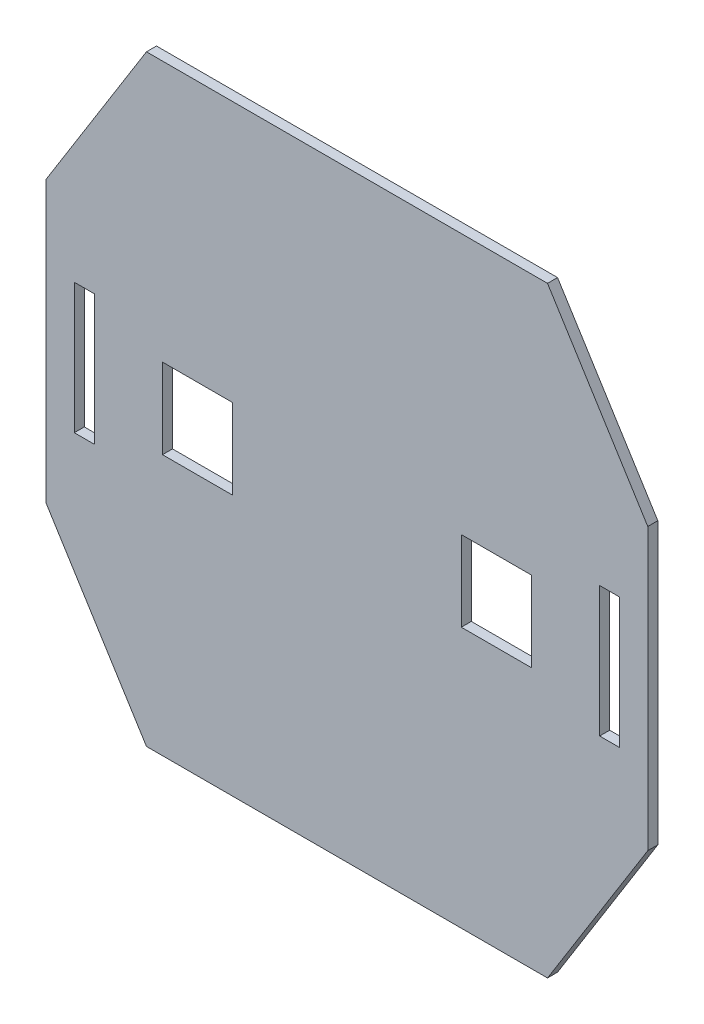
ISO-10303-21;
HEADER;
FILE_DESCRIPTION(('STEP AP214'),'2;1');
FILE_NAME('part.step','',(''),(''),'','','');
FILE_SCHEMA(('AUTOMOTIVE_DESIGN { 1 0 10303 214 1 1 1 1 }'));
ENDSEC;
DATA;
#1=APPLICATION_CONTEXT('core data for automotive mechanical design processes');
#2=APPLICATION_PROTOCOL_DEFINITION('international standard','automotive_design',2000,#1);
#3=PRODUCT_CONTEXT('',#1,'mechanical');
#4=PRODUCT('Part','Part','',(#3));
#5=PRODUCT_RELATED_PRODUCT_CATEGORY('part','',(#4));
#6=PRODUCT_DEFINITION_FORMATION('','',#4);
#7=PRODUCT_DEFINITION_CONTEXT('part definition',#1,'design');
#8=PRODUCT_DEFINITION('design','',#6,#7);
#9=PRODUCT_DEFINITION_SHAPE('','',#8);
#10=(LENGTH_UNIT() NAMED_UNIT(*) SI_UNIT(.MILLI.,.METRE.));
#11=(NAMED_UNIT(*) PLANE_ANGLE_UNIT() SI_UNIT($,.RADIAN.));
#12=(NAMED_UNIT(*) SI_UNIT($,.STERADIAN.) SOLID_ANGLE_UNIT());
#13=UNCERTAINTY_MEASURE_WITH_UNIT(LENGTH_MEASURE(1.E-05),#10,'distance_accuracy_value','');
#14=(GEOMETRIC_REPRESENTATION_CONTEXT(3) GLOBAL_UNCERTAINTY_ASSIGNED_CONTEXT((#13)) GLOBAL_UNIT_ASSIGNED_CONTEXT((#10,
#11,#12)) REPRESENTATION_CONTEXT('',''));
#15=CARTESIAN_POINT('',(0.,0.,0.));
#16=DIRECTION('',(0.,0.,1.));
#17=DIRECTION('',(1.,0.,0.));
#18=AXIS2_PLACEMENT_3D('',#15,#16,#17);
#19=CARTESIAN_POINT('',(99.9999999999999,150.,5.));
#20=DIRECTION('',(0.,-1.,0.));
#21=DIRECTION('',(1.,0.,0.));
#22=AXIS2_PLACEMENT_3D('',#19,#20,#21);
#23=PLANE('',#22);
#24=DIRECTION('',(-1.,0.,0.));
#25=VECTOR('',#24,1.);
#26=CARTESIAN_POINT('',(99.9999999999999,150.,0.));
#27=LINE('',#26,#25);
#28=CARTESIAN_POINT('',(99.9999999999999,150.,0.));
#29=VERTEX_POINT('',#28);
#30=CARTESIAN_POINT('',(-99.9999999999999,150.,0.));
#31=VERTEX_POINT('',#30);
#32=EDGE_CURVE('E281',#29,#31,#27,.T.);
#33=ORIENTED_EDGE('',*,*,#32,.T.);
#34=DIRECTION('',(0.,0.,-1.));
#35=VECTOR('',#34,1.);
#36=CARTESIAN_POINT('',(-99.9999999999999,150.,5.));
#37=LINE('',#36,#35);
#38=CARTESIAN_POINT('',(-99.9999999999999,150.,5.));
#39=VERTEX_POINT('',#38);
#40=EDGE_CURVE('E342',#39,#31,#37,.T.);
#41=ORIENTED_EDGE('',*,*,#40,.F.);
#42=DIRECTION('',(-1.,0.,0.));
#43=VECTOR('',#42,1.);
#44=CARTESIAN_POINT('',(99.9999999999999,150.,5.));
#45=LINE('',#44,#43);
#46=CARTESIAN_POINT('',(99.9999999999999,150.,5.));
#47=VERTEX_POINT('',#46);
#48=EDGE_CURVE('E288',#47,#39,#45,.T.);
#49=ORIENTED_EDGE('',*,*,#48,.F.);
#50=DIRECTION('',(0.,0.,-1.));
#51=VECTOR('',#50,1.);
#52=CARTESIAN_POINT('',(99.9999999999999,150.,5.));
#53=LINE('',#52,#51);
#54=EDGE_CURVE('E306',#47,#29,#53,.T.);
#55=ORIENTED_EDGE('',*,*,#54,.T.);
#56=EDGE_LOOP('',(#33,#41,#49,#55));
#57=FACE_BOUND('',#56,.T.);
#58=ADVANCED_FACE('F39',(#57),#23,.F.);
#59=CARTESIAN_POINT('',(-99.9999999999999,150.,5.));
#60=DIRECTION('',(0.847998304005088,-0.52999894000318,0.));
#61=DIRECTION('',(0.52999894000318,0.847998304005088,0.));
#62=AXIS2_PLACEMENT_3D('',#59,#60,#61);
#63=PLANE('',#62);
#64=DIRECTION('',(-0.52999894000318,-0.847998304005088,0.));
#65=VECTOR('',#64,1.);
#66=CARTESIAN_POINT('',(-99.9999999999999,150.,0.));
#67=LINE('',#66,#65);
#68=CARTESIAN_POINT('',(-150.,69.9999999999999,0.));
#69=VERTEX_POINT('',#68);
#70=EDGE_CURVE('E309',#31,#69,#67,.T.);
#71=ORIENTED_EDGE('',*,*,#70,.T.);
#72=DIRECTION('',(0.,0.,-1.));
#73=VECTOR('',#72,1.);
#74=CARTESIAN_POINT('',(-150.,69.9999999999999,5.));
#75=LINE('',#74,#73);
#76=CARTESIAN_POINT('',(-150.,69.9999999999999,5.));
#77=VERTEX_POINT('',#76);
#78=EDGE_CURVE('E339',#77,#69,#75,.T.);
#79=ORIENTED_EDGE('',*,*,#78,.F.);
#80=DIRECTION('',(-0.52999894000318,-0.847998304005088,0.));
#81=VECTOR('',#80,1.);
#82=CARTESIAN_POINT('',(-99.9999999999999,150.,5.));
#83=LINE('',#82,#81);
#84=EDGE_CURVE('E291',#39,#77,#83,.T.);
#85=ORIENTED_EDGE('',*,*,#84,.F.);
#86=ORIENTED_EDGE('',*,*,#40,.T.);
#87=EDGE_LOOP('',(#71,#79,#85,#86));
#88=FACE_BOUND('',#87,.T.);
#89=ADVANCED_FACE('F425',(#88),#63,.F.);
#90=CARTESIAN_POINT('',(-150.,-69.9999999999999,5.));
#91=DIRECTION('',(1.,0.,0.));
#92=DIRECTION('',(0.,0.,-1.));
#93=AXIS2_PLACEMENT_3D('',#90,#91,#92);
#94=PLANE('',#93);
#95=DIRECTION('',(0.,-1.,0.));
#96=VECTOR('',#95,1.);
#97=CARTESIAN_POINT('',(-150.,-69.9999999999999,0.));
#98=LINE('',#97,#96);
#99=CARTESIAN_POINT('',(-150.,-69.9999999999999,0.));
#100=VERTEX_POINT('',#99);
#101=EDGE_CURVE('E311',#69,#100,#98,.T.);
#102=ORIENTED_EDGE('',*,*,#101,.T.);
#103=DIRECTION('',(0.,0.,-1.));
#104=VECTOR('',#103,1.);
#105=CARTESIAN_POINT('',(-150.,-69.9999999999999,5.));
#106=LINE('',#105,#104);
#107=CARTESIAN_POINT('',(-150.,-69.9999999999999,5.));
#108=VERTEX_POINT('',#107);
#109=EDGE_CURVE('E336',#108,#100,#106,.T.);
#110=ORIENTED_EDGE('',*,*,#109,.F.);
#111=DIRECTION('',(0.,-1.,0.));
#112=VECTOR('',#111,1.);
#113=CARTESIAN_POINT('',(-150.,-69.9999999999999,5.));
#114=LINE('',#113,#112);
#115=EDGE_CURVE('E294',#77,#108,#114,.T.);
#116=ORIENTED_EDGE('',*,*,#115,.F.);
#117=ORIENTED_EDGE('',*,*,#78,.T.);
#118=EDGE_LOOP('',(#102,#110,#116,#117));
#119=FACE_BOUND('',#118,.T.);
#120=ADVANCED_FACE('F430',(#119),#94,.F.);
#121=CARTESIAN_POINT('',(-99.9999999999999,-150.,5.));
#122=DIRECTION('',(0.847998304005088,0.52999894000318,0.));
#123=DIRECTION('',(-0.52999894000318,0.847998304005088,0.));
#124=AXIS2_PLACEMENT_3D('',#121,#122,#123);
#125=PLANE('',#124);
#126=DIRECTION('',(0.52999894000318,-0.847998304005088,0.));
#127=VECTOR('',#126,1.);
#128=CARTESIAN_POINT('',(-99.9999999999999,-150.,0.));
#129=LINE('',#128,#127);
#130=CARTESIAN_POINT('',(-99.9999999999999,-150.,0.));
#131=VERTEX_POINT('',#130);
#132=EDGE_CURVE('E313',#100,#131,#129,.T.);
#133=ORIENTED_EDGE('',*,*,#132,.T.);
#134=DIRECTION('',(0.,0.,-1.));
#135=VECTOR('',#134,1.);
#136=CARTESIAN_POINT('',(-99.9999999999999,-150.,5.));
#137=LINE('',#136,#135);
#138=CARTESIAN_POINT('',(-99.9999999999999,-150.,5.));
#139=VERTEX_POINT('',#138);
#140=EDGE_CURVE('E333',#139,#131,#137,.T.);
#141=ORIENTED_EDGE('',*,*,#140,.F.);
#142=DIRECTION('',(0.52999894000318,-0.847998304005088,0.));
#143=VECTOR('',#142,1.);
#144=CARTESIAN_POINT('',(-99.9999999999999,-150.,5.));
#145=LINE('',#144,#143);
#146=EDGE_CURVE('E296',#108,#139,#145,.T.);
#147=ORIENTED_EDGE('',*,*,#146,.F.);
#148=ORIENTED_EDGE('',*,*,#109,.T.);
#149=EDGE_LOOP('',(#133,#141,#147,#148));
#150=FACE_BOUND('',#149,.T.);
#151=ADVANCED_FACE('F463',(#150),#125,.F.);
#152=CARTESIAN_POINT('',(99.9999999999999,-150.,5.));
#153=DIRECTION('',(0.,1.,0.));
#154=DIRECTION('',(-1.,0.,0.));
#155=AXIS2_PLACEMENT_3D('',#152,#153,#154);
#156=PLANE('',#155);
#157=DIRECTION('',(1.,0.,0.));
#158=VECTOR('',#157,1.);
#159=CARTESIAN_POINT('',(99.9999999999999,-150.,0.));
#160=LINE('',#159,#158);
#161=CARTESIAN_POINT('',(99.9999999999999,-150.,0.));
#162=VERTEX_POINT('',#161);
#163=EDGE_CURVE('E315',#131,#162,#160,.T.);
#164=ORIENTED_EDGE('',*,*,#163,.T.);
#165=DIRECTION('',(0.,0.,-1.));
#166=VECTOR('',#165,1.);
#167=CARTESIAN_POINT('',(99.9999999999999,-150.,5.));
#168=LINE('',#167,#166);
#169=CARTESIAN_POINT('',(99.9999999999999,-150.,5.));
#170=VERTEX_POINT('',#169);
#171=EDGE_CURVE('E330',#170,#162,#168,.T.);
#172=ORIENTED_EDGE('',*,*,#171,.F.);
#173=DIRECTION('',(1.,0.,0.));
#174=VECTOR('',#173,1.);
#175=CARTESIAN_POINT('',(99.9999999999999,-150.,5.));
#176=LINE('',#175,#174);
#177=EDGE_CURVE('E298',#139,#170,#176,.T.);
#178=ORIENTED_EDGE('',*,*,#177,.F.);
#179=ORIENTED_EDGE('',*,*,#140,.T.);
#180=EDGE_LOOP('',(#164,#172,#178,#179));
#181=FACE_BOUND('',#180,.T.);
#182=ADVANCED_FACE('F459',(#181),#156,.F.);
#183=CARTESIAN_POINT('',(99.9999999999999,-150.,5.));
#184=DIRECTION('',(-0.847998304005088,0.52999894000318,0.));
#185=DIRECTION('',(-0.52999894000318,-0.847998304005088,0.));
#186=AXIS2_PLACEMENT_3D('',#183,#184,#185);
#187=PLANE('',#186);
#188=DIRECTION('',(0.52999894000318,0.847998304005088,0.));
#189=VECTOR('',#188,1.);
#190=CARTESIAN_POINT('',(99.9999999999999,-150.,0.));
#191=LINE('',#190,#189);
#192=CARTESIAN_POINT('',(150.,-69.9999999999999,0.));
#193=VERTEX_POINT('',#192);
#194=EDGE_CURVE('E317',#162,#193,#191,.T.);
#195=ORIENTED_EDGE('',*,*,#194,.T.);
#196=DIRECTION('',(0.,0.,-1.));
#197=VECTOR('',#196,1.);
#198=CARTESIAN_POINT('',(150.,-69.9999999999999,5.));
#199=LINE('',#198,#197);
#200=CARTESIAN_POINT('',(150.,-69.9999999999999,5.));
#201=VERTEX_POINT('',#200);
#202=EDGE_CURVE('E327',#201,#193,#199,.T.);
#203=ORIENTED_EDGE('',*,*,#202,.F.);
#204=DIRECTION('',(0.52999894000318,0.847998304005088,0.));
#205=VECTOR('',#204,1.);
#206=CARTESIAN_POINT('',(99.9999999999999,-150.,5.));
#207=LINE('',#206,#205);
#208=EDGE_CURVE('E300',#170,#201,#207,.T.);
#209=ORIENTED_EDGE('',*,*,#208,.F.);
#210=ORIENTED_EDGE('',*,*,#171,.T.);
#211=EDGE_LOOP('',(#195,#203,#209,#210));
#212=FACE_BOUND('',#211,.T.);
#213=ADVANCED_FACE('F454',(#212),#187,.F.);
#214=CARTESIAN_POINT('',(150.,-69.9999999999999,5.));
#215=DIRECTION('',(-1.,0.,0.));
#216=DIRECTION('',(0.,0.,1.));
#217=AXIS2_PLACEMENT_3D('',#214,#215,#216);
#218=PLANE('',#217);
#219=DIRECTION('',(0.,1.,0.));
#220=VECTOR('',#219,1.);
#221=CARTESIAN_POINT('',(150.,-69.9999999999999,0.));
#222=LINE('',#221,#220);
#223=CARTESIAN_POINT('',(150.,69.9999999999999,0.));
#224=VERTEX_POINT('',#223);
#225=EDGE_CURVE('E319',#193,#224,#222,.T.);
#226=ORIENTED_EDGE('',*,*,#225,.T.);
#227=DIRECTION('',(0.,0.,-1.));
#228=VECTOR('',#227,1.);
#229=CARTESIAN_POINT('',(150.,69.9999999999999,5.));
#230=LINE('',#229,#228);
#231=CARTESIAN_POINT('',(150.,69.9999999999999,5.));
#232=VERTEX_POINT('',#231);
#233=EDGE_CURVE('E324',#232,#224,#230,.T.);
#234=ORIENTED_EDGE('',*,*,#233,.F.);
#235=DIRECTION('',(0.,1.,0.));
#236=VECTOR('',#235,1.);
#237=CARTESIAN_POINT('',(150.,-69.9999999999999,5.));
#238=LINE('',#237,#236);
#239=EDGE_CURVE('E302',#201,#232,#238,.T.);
#240=ORIENTED_EDGE('',*,*,#239,.F.);
#241=ORIENTED_EDGE('',*,*,#202,.T.);
#242=EDGE_LOOP('',(#226,#234,#240,#241));
#243=FACE_BOUND('',#242,.T.);
#244=ADVANCED_FACE('F449',(#243),#218,.F.);
#245=CARTESIAN_POINT('',(99.9999999999999,150.,5.));
#246=DIRECTION('',(-0.847998304005088,-0.52999894000318,0.));
#247=DIRECTION('',(0.52999894000318,-0.847998304005088,0.));
#248=AXIS2_PLACEMENT_3D('',#245,#246,#247);
#249=PLANE('',#248);
#250=DIRECTION('',(-0.52999894000318,0.847998304005088,0.));
#251=VECTOR('',#250,1.);
#252=CARTESIAN_POINT('',(99.9999999999999,150.,0.));
#253=LINE('',#252,#251);
#254=EDGE_CURVE('E292',#224,#29,#253,.T.);
#255=ORIENTED_EDGE('',*,*,#254,.T.);
#256=ORIENTED_EDGE('',*,*,#54,.F.);
#257=DIRECTION('',(-0.52999894000318,0.847998304005088,0.));
#258=VECTOR('',#257,1.);
#259=CARTESIAN_POINT('',(99.9999999999999,150.,5.));
#260=LINE('',#259,#258);
#261=EDGE_CURVE('E304',#232,#47,#260,.T.);
#262=ORIENTED_EDGE('',*,*,#261,.F.);
#263=ORIENTED_EDGE('',*,*,#233,.T.);
#264=EDGE_LOOP('',(#255,#256,#262,#263));
#265=FACE_BOUND('',#264,.T.);
#266=ADVANCED_FACE('F397',(#265),#249,.F.);
#267=CARTESIAN_POINT('',(0.,0.,5.));
#268=DIRECTION('',(0.,0.,-1.));
#269=DIRECTION('',(-1.,0.,0.));
#270=AXIS2_PLACEMENT_3D('',#267,#268,#269);
#271=PLANE('',#270);
#272=DIRECTION('',(-1.,0.,0.));
#273=VECTOR('',#272,1.);
#274=CARTESIAN_POINT('',(135.993475802712,32.5,5.));
#275=LINE('',#274,#273);
#276=CARTESIAN_POINT('',(135.993475802712,32.5,5.));
#277=VERTEX_POINT('',#276);
#278=CARTESIAN_POINT('',(125.993475802712,32.5,5.));
#279=VERTEX_POINT('',#278);
#280=EDGE_CURVE('E266',#277,#279,#275,.T.);
#281=ORIENTED_EDGE('',*,*,#280,.F.);
#282=DIRECTION('',(0.,1.,0.));
#283=VECTOR('',#282,1.);
#284=CARTESIAN_POINT('',(135.993475802712,-32.5,5.));
#285=LINE('',#284,#283);
#286=CARTESIAN_POINT('',(135.993475802712,-32.5,5.));
#287=VERTEX_POINT('',#286);
#288=EDGE_CURVE('E53',#287,#277,#285,.T.);
#289=ORIENTED_EDGE('',*,*,#288,.F.);
#290=DIRECTION('',(1.,0.,0.));
#291=VECTOR('',#290,1.);
#292=CARTESIAN_POINT('',(135.993475802712,-32.5,5.));
#293=LINE('',#292,#291);
#294=CARTESIAN_POINT('',(125.993475802712,-32.5,5.));
#295=VERTEX_POINT('',#294);
#296=EDGE_CURVE('E254',#295,#287,#293,.T.);
#297=ORIENTED_EDGE('',*,*,#296,.F.);
#298=DIRECTION('',(0.,-1.,0.));
#299=VECTOR('',#298,1.);
#300=CARTESIAN_POINT('',(125.993475802712,-32.5,5.));
#301=LINE('',#300,#299);
#302=EDGE_CURVE('E263',#279,#295,#301,.T.);
#303=ORIENTED_EDGE('',*,*,#302,.F.);
#304=EDGE_LOOP('',(#281,#289,#297,#303));
#305=FACE_BOUND('',#304,.T.);
#306=DIRECTION('',(-1.,0.,0.));
#307=VECTOR('',#306,1.);
#308=CARTESIAN_POINT('',(-135.993475802712,32.5,5.));
#309=LINE('',#308,#307);
#310=CARTESIAN_POINT('',(-125.993475802712,32.5,5.));
#311=VERTEX_POINT('',#310);
#312=CARTESIAN_POINT('',(-135.993475802712,32.5,5.));
#313=VERTEX_POINT('',#312);
#314=EDGE_CURVE('E248',#311,#313,#309,.T.);
#315=ORIENTED_EDGE('',*,*,#314,.F.);
#316=DIRECTION('',(0.,1.,0.));
#317=VECTOR('',#316,1.);
#318=CARTESIAN_POINT('',(-125.993475802712,-32.5,5.));
#319=LINE('',#318,#317);
#320=CARTESIAN_POINT('',(-125.993475802712,-32.5,5.));
#321=VERTEX_POINT('',#320);
#322=EDGE_CURVE('E61',#321,#311,#319,.T.);
#323=ORIENTED_EDGE('',*,*,#322,.F.);
#324=DIRECTION('',(1.,0.,0.));
#325=VECTOR('',#324,1.);
#326=CARTESIAN_POINT('',(-135.993475802712,-32.5,5.));
#327=LINE('',#326,#325);
#328=CARTESIAN_POINT('',(-135.993475802712,-32.5,5.));
#329=VERTEX_POINT('',#328);
#330=EDGE_CURVE('E236',#329,#321,#327,.T.);
#331=ORIENTED_EDGE('',*,*,#330,.F.);
#332=DIRECTION('',(0.,-1.,0.));
#333=VECTOR('',#332,1.);
#334=CARTESIAN_POINT('',(-135.993475802712,-32.5,5.));
#335=LINE('',#334,#333);
#336=EDGE_CURVE('E245',#313,#329,#335,.T.);
#337=ORIENTED_EDGE('',*,*,#336,.F.);
#338=EDGE_LOOP('',(#315,#323,#331,#337));
#339=FACE_BOUND('',#338,.T.);
#340=DIRECTION('',(1.,0.,0.));
#341=VECTOR('',#340,1.);
#342=CARTESIAN_POINT('',(57.,-20.,5.));
#343=LINE('',#342,#341);
#344=CARTESIAN_POINT('',(57.,-20.,5.));
#345=VERTEX_POINT('',#344);
#346=CARTESIAN_POINT('',(92.,-20.,5.));
#347=VERTEX_POINT('',#346);
#348=EDGE_CURVE('E226',#345,#347,#343,.T.);
#349=ORIENTED_EDGE('',*,*,#348,.F.);
#350=DIRECTION('',(0.,-1.,0.));
#351=VECTOR('',#350,1.);
#352=CARTESIAN_POINT('',(57.,-20.,5.));
#353=LINE('',#352,#351);
#354=CARTESIAN_POINT('',(57.,20.,5.));
#355=VERTEX_POINT('',#354);
#356=EDGE_CURVE('E204',#355,#345,#353,.T.);
#357=ORIENTED_EDGE('',*,*,#356,.F.);
#358=DIRECTION('',(-1.,0.,0.));
#359=VECTOR('',#358,1.);
#360=CARTESIAN_POINT('',(57.,20.,5.));
#361=LINE('',#360,#359);
#362=CARTESIAN_POINT('',(92.,20.,5.));
#363=VERTEX_POINT('',#362);
#364=EDGE_CURVE('E213',#363,#355,#361,.T.);
#365=ORIENTED_EDGE('',*,*,#364,.F.);
#366=DIRECTION('',(0.,1.,0.));
#367=VECTOR('',#366,1.);
#368=CARTESIAN_POINT('',(92.,-20.,5.));
#369=LINE('',#368,#367);
#370=EDGE_CURVE('E219',#347,#363,#369,.T.);
#371=ORIENTED_EDGE('',*,*,#370,.F.);
#372=EDGE_LOOP('',(#349,#357,#365,#371));
#373=FACE_BOUND('',#372,.T.);
#374=DIRECTION('',(1.,0.,0.));
#375=VECTOR('',#374,1.);
#376=CARTESIAN_POINT('',(-57.,-20.,5.));
#377=LINE('',#376,#375);
#378=CARTESIAN_POINT('',(-92.,-20.,5.));
#379=VERTEX_POINT('',#378);
#380=CARTESIAN_POINT('',(-57.,-20.,5.));
#381=VERTEX_POINT('',#380);
#382=EDGE_CURVE('E229',#379,#381,#377,.T.);
#383=ORIENTED_EDGE('',*,*,#382,.F.);
#384=DIRECTION('',(0.,-1.,0.));
#385=VECTOR('',#384,1.);
#386=CARTESIAN_POINT('',(-92.,-20.,5.));
#387=LINE('',#386,#385);
#388=CARTESIAN_POINT('',(-92.,20.,5.));
#389=VERTEX_POINT('',#388);
#390=EDGE_CURVE('E227',#389,#379,#387,.T.);
#391=ORIENTED_EDGE('',*,*,#390,.F.);
#392=DIRECTION('',(-1.,0.,0.));
#393=VECTOR('',#392,1.);
#394=CARTESIAN_POINT('',(-57.,20.,5.));
#395=LINE('',#394,#393);
#396=CARTESIAN_POINT('',(-57.,20.,5.));
#397=VERTEX_POINT('',#396);
#398=EDGE_CURVE('E275',#397,#389,#395,.T.);
#399=ORIENTED_EDGE('',*,*,#398,.F.);
#400=DIRECTION('',(0.,1.,0.));
#401=VECTOR('',#400,1.);
#402=CARTESIAN_POINT('',(-57.,-20.,5.));
#403=LINE('',#402,#401);
#404=EDGE_CURVE('E272',#381,#397,#403,.T.);
#405=ORIENTED_EDGE('',*,*,#404,.F.);
#406=EDGE_LOOP('',(#383,#391,#399,#405));
#407=FACE_BOUND('',#406,.T.);
#408=ORIENTED_EDGE('',*,*,#48,.T.);
#409=ORIENTED_EDGE('',*,*,#84,.T.);
#410=ORIENTED_EDGE('',*,*,#115,.T.);
#411=ORIENTED_EDGE('',*,*,#146,.T.);
#412=ORIENTED_EDGE('',*,*,#177,.T.);
#413=ORIENTED_EDGE('',*,*,#208,.T.);
#414=ORIENTED_EDGE('',*,*,#239,.T.);
#415=ORIENTED_EDGE('',*,*,#261,.T.);
#416=EDGE_LOOP('',(#408,#409,#410,#411,#412,#413,#414,#415));
#417=FACE_BOUND('',#416,.T.);
#418=ADVANCED_FACE('F223',(#305,#339,#373,#407,#417),#271,.F.);
#419=CARTESIAN_POINT('',(0.,0.,0.));
#420=DIRECTION('',(0.,0.,-1.));
#421=DIRECTION('',(-1.,0.,0.));
#422=AXIS2_PLACEMENT_3D('',#419,#420,#421);
#423=PLANE('',#422);
#424=DIRECTION('',(0.,-1.,0.));
#425=VECTOR('',#424,1.);
#426=CARTESIAN_POINT('',(135.993475802712,0.,0.));
#427=LINE('',#426,#425);
#428=CARTESIAN_POINT('',(135.993475802712,32.5,0.));
#429=VERTEX_POINT('',#428);
#430=CARTESIAN_POINT('',(135.993475802712,-32.5,0.));
#431=VERTEX_POINT('',#430);
#432=EDGE_CURVE('E11',#429,#431,#427,.T.);
#433=ORIENTED_EDGE('',*,*,#432,.F.);
#434=DIRECTION('',(1.,0.,0.));
#435=VECTOR('',#434,1.);
#436=CARTESIAN_POINT('',(0.,32.4999999999999,0.));
#437=LINE('',#436,#435);
#438=CARTESIAN_POINT('',(125.993475802712,32.5,0.));
#439=VERTEX_POINT('',#438);
#440=EDGE_CURVE('E371',#439,#429,#437,.T.);
#441=ORIENTED_EDGE('',*,*,#440,.F.);
#442=DIRECTION('',(0.,1.,0.));
#443=VECTOR('',#442,1.);
#444=CARTESIAN_POINT('',(125.993475802712,0.,0.));
#445=LINE('',#444,#443);
#446=CARTESIAN_POINT('',(125.993475802712,-32.5,0.));
#447=VERTEX_POINT('',#446);
#448=EDGE_CURVE('E373',#447,#439,#445,.T.);
#449=ORIENTED_EDGE('',*,*,#448,.F.);
#450=DIRECTION('',(-1.,0.,0.));
#451=VECTOR('',#450,1.);
#452=CARTESIAN_POINT('',(0.,-32.5000000000001,0.));
#453=LINE('',#452,#451);
#454=EDGE_CURVE('E46',#431,#447,#453,.T.);
#455=ORIENTED_EDGE('',*,*,#454,.F.);
#456=EDGE_LOOP('',(#433,#441,#449,#455));
#457=FACE_BOUND('',#456,.T.);
#458=DIRECTION('',(0.,-1.,0.));
#459=VECTOR('',#458,1.);
#460=CARTESIAN_POINT('',(-125.993475802712,0.,0.));
#461=LINE('',#460,#459);
#462=CARTESIAN_POINT('',(-125.993475802712,32.5,0.));
#463=VERTEX_POINT('',#462);
#464=CARTESIAN_POINT('',(-125.993475802712,-32.5,0.));
#465=VERTEX_POINT('',#464);
#466=EDGE_CURVE('E369',#463,#465,#461,.T.);
#467=ORIENTED_EDGE('',*,*,#466,.F.);
#468=DIRECTION('',(1.,0.,0.));
#469=VECTOR('',#468,1.);
#470=CARTESIAN_POINT('',(0.,32.5,0.));
#471=LINE('',#470,#469);
#472=CARTESIAN_POINT('',(-135.993475802712,32.5,0.));
#473=VERTEX_POINT('',#472);
#474=EDGE_CURVE('E362',#473,#463,#471,.T.);
#475=ORIENTED_EDGE('',*,*,#474,.F.);
#476=DIRECTION('',(0.,1.,0.));
#477=VECTOR('',#476,1.);
#478=CARTESIAN_POINT('',(-135.993475802712,0.,0.));
#479=LINE('',#478,#477);
#480=CARTESIAN_POINT('',(-135.993475802712,-32.5,0.));
#481=VERTEX_POINT('',#480);
#482=EDGE_CURVE('E364',#481,#473,#479,.T.);
#483=ORIENTED_EDGE('',*,*,#482,.F.);
#484=DIRECTION('',(-1.,0.,0.));
#485=VECTOR('',#484,1.);
#486=CARTESIAN_POINT('',(0.,-32.5,0.));
#487=LINE('',#486,#485);
#488=EDGE_CURVE('E367',#465,#481,#487,.T.);
#489=ORIENTED_EDGE('',*,*,#488,.F.);
#490=EDGE_LOOP('',(#467,#475,#483,#489));
#491=FACE_BOUND('',#490,.T.);
#492=DIRECTION('',(0.,1.,0.));
#493=VECTOR('',#492,1.);
#494=CARTESIAN_POINT('',(57.,0.,0.));
#495=LINE('',#494,#493);
#496=CARTESIAN_POINT('',(57.,-20.,0.));
#497=VERTEX_POINT('',#496);
#498=CARTESIAN_POINT('',(57.,20.,0.));
#499=VERTEX_POINT('',#498);
#500=EDGE_CURVE('E207',#497,#499,#495,.T.);
#501=ORIENTED_EDGE('',*,*,#500,.F.);
#502=DIRECTION('',(-1.,0.,0.));
#503=VECTOR('',#502,1.);
#504=CARTESIAN_POINT('',(0.,-20.,0.));
#505=LINE('',#504,#503);
#506=CARTESIAN_POINT('',(92.,-20.,0.));
#507=VERTEX_POINT('',#506);
#508=EDGE_CURVE('E354',#507,#497,#505,.T.);
#509=ORIENTED_EDGE('',*,*,#508,.F.);
#510=DIRECTION('',(0.,-1.,0.));
#511=VECTOR('',#510,1.);
#512=CARTESIAN_POINT('',(92.,0.,0.));
#513=LINE('',#512,#511);
#514=CARTESIAN_POINT('',(92.,20.,0.));
#515=VERTEX_POINT('',#514);
#516=EDGE_CURVE('E356',#515,#507,#513,.T.);
#517=ORIENTED_EDGE('',*,*,#516,.F.);
#518=DIRECTION('',(1.,0.,0.));
#519=VECTOR('',#518,1.);
#520=CARTESIAN_POINT('',(0.,20.,0.));
#521=LINE('',#520,#519);
#522=EDGE_CURVE('E359',#499,#515,#521,.T.);
#523=ORIENTED_EDGE('',*,*,#522,.F.);
#524=EDGE_LOOP('',(#501,#509,#517,#523));
#525=FACE_BOUND('',#524,.T.);
#526=DIRECTION('',(0.,1.,0.));
#527=VECTOR('',#526,1.);
#528=CARTESIAN_POINT('',(-92.,0.,0.));
#529=LINE('',#528,#527);
#530=CARTESIAN_POINT('',(-92.,-20.,0.));
#531=VERTEX_POINT('',#530);
#532=CARTESIAN_POINT('',(-92.,20.,0.));
#533=VERTEX_POINT('',#532);
#534=EDGE_CURVE('E352',#531,#533,#529,.T.);
#535=ORIENTED_EDGE('',*,*,#534,.F.);
#536=DIRECTION('',(-1.,0.,0.));
#537=VECTOR('',#536,1.);
#538=CARTESIAN_POINT('',(0.,-20.,0.));
#539=LINE('',#538,#537);
#540=CARTESIAN_POINT('',(-57.,-20.,0.));
#541=VERTEX_POINT('',#540);
#542=EDGE_CURVE('E345',#541,#531,#539,.T.);
#543=ORIENTED_EDGE('',*,*,#542,.F.);
#544=DIRECTION('',(0.,-1.,0.));
#545=VECTOR('',#544,1.);
#546=CARTESIAN_POINT('',(-57.,0.,0.));
#547=LINE('',#546,#545);
#548=CARTESIAN_POINT('',(-57.,20.,0.));
#549=VERTEX_POINT('',#548);
#550=EDGE_CURVE('E347',#549,#541,#547,.T.);
#551=ORIENTED_EDGE('',*,*,#550,.F.);
#552=DIRECTION('',(1.,0.,0.));
#553=VECTOR('',#552,1.);
#554=CARTESIAN_POINT('',(0.,20.,0.));
#555=LINE('',#554,#553);
#556=EDGE_CURVE('E350',#533,#549,#555,.T.);
#557=ORIENTED_EDGE('',*,*,#556,.F.);
#558=EDGE_LOOP('',(#535,#543,#551,#557));
#559=FACE_BOUND('',#558,.T.);
#560=ORIENTED_EDGE('',*,*,#32,.F.);
#561=ORIENTED_EDGE('',*,*,#254,.F.);
#562=ORIENTED_EDGE('',*,*,#225,.F.);
#563=ORIENTED_EDGE('',*,*,#194,.F.);
#564=ORIENTED_EDGE('',*,*,#163,.F.);
#565=ORIENTED_EDGE('',*,*,#132,.F.);
#566=ORIENTED_EDGE('',*,*,#101,.F.);
#567=ORIENTED_EDGE('',*,*,#70,.F.);
#568=EDGE_LOOP('',(#560,#561,#562,#563,#564,#565,#566,#567));
#569=FACE_BOUND('',#568,.T.);
#570=ADVANCED_FACE('F388',(#457,#491,#525,#559,#569),#423,.T.);
#571=CARTESIAN_POINT('',(-92.,-20.,-15.));
#572=DIRECTION('',(-1.,0.,0.));
#573=DIRECTION('',(0.,0.,1.));
#574=AXIS2_PLACEMENT_3D('',#571,#572,#573);
#575=PLANE('',#574);
#576=ORIENTED_EDGE('',*,*,#534,.T.);
#577=DIRECTION('',(0.,0.,1.));
#578=VECTOR('',#577,1.);
#579=CARTESIAN_POINT('',(-92.,20.,-15.));
#580=LINE('',#579,#578);
#581=EDGE_CURVE('E279',#533,#389,#580,.T.);
#582=ORIENTED_EDGE('',*,*,#581,.T.);
#583=ORIENTED_EDGE('',*,*,#390,.T.);
#584=DIRECTION('',(0.,0.,1.));
#585=VECTOR('',#584,1.);
#586=CARTESIAN_POINT('',(-92.,-20.,-15.));
#587=LINE('',#586,#585);
#588=EDGE_CURVE('E278',#531,#379,#587,.T.);
#589=ORIENTED_EDGE('',*,*,#588,.F.);
#590=EDGE_LOOP('',(#576,#582,#583,#589));
#591=FACE_BOUND('',#590,.T.);
#592=ADVANCED_FACE('F482',(#591),#575,.F.);
#593=CARTESIAN_POINT('',(-57.,20.,-15.));
#594=DIRECTION('',(0.,1.,0.));
#595=DIRECTION('',(-1.,0.,0.));
#596=AXIS2_PLACEMENT_3D('',#593,#594,#595);
#597=PLANE('',#596);
#598=ORIENTED_EDGE('',*,*,#556,.T.);
#599=DIRECTION('',(0.,0.,1.));
#600=VECTOR('',#599,1.);
#601=CARTESIAN_POINT('',(-57.,20.,-15.));
#602=LINE('',#601,#600);
#603=EDGE_CURVE('E282',#549,#397,#602,.T.);
#604=ORIENTED_EDGE('',*,*,#603,.T.);
#605=ORIENTED_EDGE('',*,*,#398,.T.);
#606=ORIENTED_EDGE('',*,*,#581,.F.);
#607=EDGE_LOOP('',(#598,#604,#605,#606));
#608=FACE_BOUND('',#607,.T.);
#609=ADVANCED_FACE('F486',(#608),#597,.F.);
#610=CARTESIAN_POINT('',(-57.,-20.,-15.));
#611=DIRECTION('',(1.,0.,0.));
#612=DIRECTION('',(0.,0.,-1.));
#613=AXIS2_PLACEMENT_3D('',#610,#611,#612);
#614=PLANE('',#613);
#615=ORIENTED_EDGE('',*,*,#550,.T.);
#616=DIRECTION('',(0.,0.,1.));
#617=VECTOR('',#616,1.);
#618=CARTESIAN_POINT('',(-57.,-20.,-15.));
#619=LINE('',#618,#617);
#620=EDGE_CURVE('E284',#541,#381,#619,.T.);
#621=ORIENTED_EDGE('',*,*,#620,.T.);
#622=ORIENTED_EDGE('',*,*,#404,.T.);
#623=ORIENTED_EDGE('',*,*,#603,.F.);
#624=EDGE_LOOP('',(#615,#621,#622,#623));
#625=FACE_BOUND('',#624,.T.);
#626=ADVANCED_FACE('F491',(#625),#614,.F.);
#627=CARTESIAN_POINT('',(-57.,-20.,-15.));
#628=DIRECTION('',(0.,-1.,0.));
#629=DIRECTION('',(1.,0.,0.));
#630=AXIS2_PLACEMENT_3D('',#627,#628,#629);
#631=PLANE('',#630);
#632=ORIENTED_EDGE('',*,*,#542,.T.);
#633=ORIENTED_EDGE('',*,*,#588,.T.);
#634=ORIENTED_EDGE('',*,*,#382,.T.);
#635=ORIENTED_EDGE('',*,*,#620,.F.);
#636=EDGE_LOOP('',(#632,#633,#634,#635));
#637=FACE_BOUND('',#636,.T.);
#638=ADVANCED_FACE('F488',(#637),#631,.F.);
#639=CARTESIAN_POINT('',(57.,-20.,-15.));
#640=DIRECTION('',(-1.,0.,0.));
#641=DIRECTION('',(0.,0.,1.));
#642=AXIS2_PLACEMENT_3D('',#639,#640,#641);
#643=PLANE('',#642);
#644=ORIENTED_EDGE('',*,*,#500,.T.);
#645=DIRECTION('',(0.,0.,1.));
#646=VECTOR('',#645,1.);
#647=CARTESIAN_POINT('',(57.,20.,-15.));
#648=LINE('',#647,#646);
#649=EDGE_CURVE('E199',#499,#355,#648,.T.);
#650=ORIENTED_EDGE('',*,*,#649,.T.);
#651=ORIENTED_EDGE('',*,*,#356,.T.);
#652=DIRECTION('',(0.,0.,1.));
#653=VECTOR('',#652,1.);
#654=CARTESIAN_POINT('',(57.,-20.,-15.));
#655=LINE('',#654,#653);
#656=EDGE_CURVE('E220',#497,#345,#655,.T.);
#657=ORIENTED_EDGE('',*,*,#656,.F.);
#658=EDGE_LOOP('',(#644,#650,#651,#657));
#659=FACE_BOUND('',#658,.T.);
#660=ADVANCED_FACE('F201',(#659),#643,.F.);
#661=CARTESIAN_POINT('',(57.,20.,-15.));
#662=DIRECTION('',(0.,1.,0.));
#663=DIRECTION('',(0.,0.,1.));
#664=AXIS2_PLACEMENT_3D('',#661,#662,#663);
#665=PLANE('',#664);
#666=ORIENTED_EDGE('',*,*,#522,.T.);
#667=DIRECTION('',(0.,0.,1.));
#668=VECTOR('',#667,1.);
#669=CARTESIAN_POINT('',(92.,20.,-15.));
#670=LINE('',#669,#668);
#671=EDGE_CURVE('E210',#515,#363,#670,.T.);
#672=ORIENTED_EDGE('',*,*,#671,.T.);
#673=ORIENTED_EDGE('',*,*,#364,.T.);
#674=ORIENTED_EDGE('',*,*,#649,.F.);
#675=EDGE_LOOP('',(#666,#672,#673,#674));
#676=FACE_BOUND('',#675,.T.);
#677=ADVANCED_FACE('F214',(#676),#665,.F.);
#678=CARTESIAN_POINT('',(92.,-20.,-15.));
#679=DIRECTION('',(1.,0.,0.));
#680=DIRECTION('',(0.,1.,0.));
#681=AXIS2_PLACEMENT_3D('',#678,#679,#680);
#682=PLANE('',#681);
#683=ORIENTED_EDGE('',*,*,#516,.T.);
#684=DIRECTION('',(0.,0.,1.));
#685=VECTOR('',#684,1.);
#686=CARTESIAN_POINT('',(92.,-20.,-15.));
#687=LINE('',#686,#685);
#688=EDGE_CURVE('E774',#507,#347,#687,.T.);
#689=ORIENTED_EDGE('',*,*,#688,.T.);
#690=ORIENTED_EDGE('',*,*,#370,.T.);
#691=ORIENTED_EDGE('',*,*,#671,.F.);
#692=EDGE_LOOP('',(#683,#689,#690,#691));
#693=FACE_BOUND('',#692,.T.);
#694=ADVANCED_FACE('F581',(#693),#682,.F.);
#695=CARTESIAN_POINT('',(57.,-20.,-15.));
#696=DIRECTION('',(0.,-1.,0.));
#697=DIRECTION('',(0.,0.,-1.));
#698=AXIS2_PLACEMENT_3D('',#695,#696,#697);
#699=PLANE('',#698);
#700=ORIENTED_EDGE('',*,*,#508,.T.);
#701=ORIENTED_EDGE('',*,*,#656,.T.);
#702=ORIENTED_EDGE('',*,*,#348,.T.);
#703=ORIENTED_EDGE('',*,*,#688,.F.);
#704=EDGE_LOOP('',(#700,#701,#702,#703));
#705=FACE_BOUND('',#704,.T.);
#706=ADVANCED_FACE('F570',(#705),#699,.F.);
#707=CARTESIAN_POINT('',(-125.993475802712,-32.5,-15.));
#708=DIRECTION('',(1.,0.,0.));
#709=DIRECTION('',(0.,0.,-1.));
#710=AXIS2_PLACEMENT_3D('',#707,#708,#709);
#711=PLANE('',#710);
#712=ORIENTED_EDGE('',*,*,#466,.T.);
#713=DIRECTION('',(0.,0.,1.));
#714=VECTOR('',#713,1.);
#715=CARTESIAN_POINT('',(-125.993475802712,-32.5,-15.));
#716=LINE('',#715,#714);
#717=EDGE_CURVE('E241',#465,#321,#716,.T.);
#718=ORIENTED_EDGE('',*,*,#717,.T.);
#719=ORIENTED_EDGE('',*,*,#322,.T.);
#720=DIRECTION('',(0.,0.,1.));
#721=VECTOR('',#720,1.);
#722=CARTESIAN_POINT('',(-125.993475802712,32.5,-15.));
#723=LINE('',#722,#721);
#724=EDGE_CURVE('E234',#463,#311,#723,.T.);
#725=ORIENTED_EDGE('',*,*,#724,.F.);
#726=EDGE_LOOP('',(#712,#718,#719,#725));
#727=FACE_BOUND('',#726,.T.);
#728=ADVANCED_FACE('F406',(#727),#711,.F.);
#729=CARTESIAN_POINT('',(-135.993475802712,-32.5,-15.));
#730=DIRECTION('',(0.,-1.,0.));
#731=DIRECTION('',(0.,0.,-1.));
#732=AXIS2_PLACEMENT_3D('',#729,#730,#731);
#733=PLANE('',#732);
#734=ORIENTED_EDGE('',*,*,#488,.T.);
#735=DIRECTION('',(0.,0.,1.));
#736=VECTOR('',#735,1.);
#737=CARTESIAN_POINT('',(-135.993475802712,-32.5,-15.));
#738=LINE('',#737,#736);
#739=EDGE_CURVE('E239',#481,#329,#738,.T.);
#740=ORIENTED_EDGE('',*,*,#739,.T.);
#741=ORIENTED_EDGE('',*,*,#330,.T.);
#742=ORIENTED_EDGE('',*,*,#717,.F.);
#743=EDGE_LOOP('',(#734,#740,#741,#742));
#744=FACE_BOUND('',#743,.T.);
#745=ADVANCED_FACE('F413',(#744),#733,.F.);
#746=CARTESIAN_POINT('',(-135.993475802712,-32.5,-15.));
#747=DIRECTION('',(-1.,0.,0.));
#748=DIRECTION('',(0.,0.,1.));
#749=AXIS2_PLACEMENT_3D('',#746,#747,#748);
#750=PLANE('',#749);
#751=ORIENTED_EDGE('',*,*,#482,.T.);
#752=DIRECTION('',(0.,0.,1.));
#753=VECTOR('',#752,1.);
#754=CARTESIAN_POINT('',(-135.993475802712,32.5,-15.));
#755=LINE('',#754,#753);
#756=EDGE_CURVE('E237',#473,#313,#755,.T.);
#757=ORIENTED_EDGE('',*,*,#756,.T.);
#758=ORIENTED_EDGE('',*,*,#336,.T.);
#759=ORIENTED_EDGE('',*,*,#739,.F.);
#760=EDGE_LOOP('',(#751,#757,#758,#759));
#761=FACE_BOUND('',#760,.T.);
#762=ADVANCED_FACE('F415',(#761),#750,.F.);
#763=CARTESIAN_POINT('',(-135.993475802712,32.5,-15.));
#764=DIRECTION('',(0.,1.,0.));
#765=DIRECTION('',(0.,0.,1.));
#766=AXIS2_PLACEMENT_3D('',#763,#764,#765);
#767=PLANE('',#766);
#768=ORIENTED_EDGE('',*,*,#474,.T.);
#769=ORIENTED_EDGE('',*,*,#724,.T.);
#770=ORIENTED_EDGE('',*,*,#314,.T.);
#771=ORIENTED_EDGE('',*,*,#756,.F.);
#772=EDGE_LOOP('',(#768,#769,#770,#771));
#773=FACE_BOUND('',#772,.T.);
#774=ADVANCED_FACE('F403',(#773),#767,.F.);
#775=CARTESIAN_POINT('',(135.993475802712,-32.5,-15.));
#776=DIRECTION('',(1.,0.,0.));
#777=DIRECTION('',(0.,0.,-1.));
#778=AXIS2_PLACEMENT_3D('',#775,#776,#777);
#779=PLANE('',#778);
#780=ORIENTED_EDGE('',*,*,#432,.T.);
#781=DIRECTION('',(0.,0.,1.));
#782=VECTOR('',#781,1.);
#783=CARTESIAN_POINT('',(135.993475802712,-32.5,-15.));
#784=LINE('',#783,#782);
#785=EDGE_CURVE('E259',#431,#287,#784,.T.);
#786=ORIENTED_EDGE('',*,*,#785,.T.);
#787=ORIENTED_EDGE('',*,*,#288,.T.);
#788=DIRECTION('',(0.,0.,1.));
#789=VECTOR('',#788,1.);
#790=CARTESIAN_POINT('',(135.993475802712,32.5,-15.));
#791=LINE('',#790,#789);
#792=EDGE_CURVE('E252',#429,#277,#791,.T.);
#793=ORIENTED_EDGE('',*,*,#792,.F.);
#794=EDGE_LOOP('',(#780,#786,#787,#793));
#795=FACE_BOUND('',#794,.T.);
#796=ADVANCED_FACE('F393',(#795),#779,.F.);
#797=CARTESIAN_POINT('',(135.993475802712,-32.5,-15.));
#798=DIRECTION('',(0.,-1.,0.));
#799=DIRECTION('',(1.,0.,0.));
#800=AXIS2_PLACEMENT_3D('',#797,#798,#799);
#801=PLANE('',#800);
#802=ORIENTED_EDGE('',*,*,#454,.T.);
#803=DIRECTION('',(0.,0.,1.));
#804=VECTOR('',#803,1.);
#805=CARTESIAN_POINT('',(125.993475802712,-32.5,-15.));
#806=LINE('',#805,#804);
#807=EDGE_CURVE('E257',#447,#295,#806,.T.);
#808=ORIENTED_EDGE('',*,*,#807,.T.);
#809=ORIENTED_EDGE('',*,*,#296,.T.);
#810=ORIENTED_EDGE('',*,*,#785,.F.);
#811=EDGE_LOOP('',(#802,#808,#809,#810));
#812=FACE_BOUND('',#811,.T.);
#813=ADVANCED_FACE('F379',(#812),#801,.F.);
#814=CARTESIAN_POINT('',(125.993475802712,-32.5,-15.));
#815=DIRECTION('',(-1.,0.,0.));
#816=DIRECTION('',(0.,0.,1.));
#817=AXIS2_PLACEMENT_3D('',#814,#815,#816);
#818=PLANE('',#817);
#819=ORIENTED_EDGE('',*,*,#448,.T.);
#820=DIRECTION('',(0.,0.,1.));
#821=VECTOR('',#820,1.);
#822=CARTESIAN_POINT('',(125.993475802712,32.5,-15.));
#823=LINE('',#822,#821);
#824=EDGE_CURVE('E255',#439,#279,#823,.T.);
#825=ORIENTED_EDGE('',*,*,#824,.T.);
#826=ORIENTED_EDGE('',*,*,#302,.T.);
#827=ORIENTED_EDGE('',*,*,#807,.F.);
#828=EDGE_LOOP('',(#819,#825,#826,#827));
#829=FACE_BOUND('',#828,.T.);
#830=ADVANCED_FACE('F384',(#829),#818,.F.);
#831=CARTESIAN_POINT('',(135.993475802712,32.5,-15.));
#832=DIRECTION('',(0.,1.,0.));
#833=DIRECTION('',(-1.,0.,0.));
#834=AXIS2_PLACEMENT_3D('',#831,#832,#833);
#835=PLANE('',#834);
#836=ORIENTED_EDGE('',*,*,#440,.T.);
#837=ORIENTED_EDGE('',*,*,#792,.T.);
#838=ORIENTED_EDGE('',*,*,#280,.T.);
#839=ORIENTED_EDGE('',*,*,#824,.F.);
#840=EDGE_LOOP('',(#836,#837,#838,#839));
#841=FACE_BOUND('',#840,.T.);
#842=ADVANCED_FACE('F391',(#841),#835,.F.);
#843=CLOSED_SHELL('',(#58,#89,#120,#151,#182,#213,#244,#266,#418,#570,#592,#609,#626,#638,#660,
#677,#694,#706,#728,#745,#762,#774,#796,#813,#830,#842));
#844=MANIFOLD_SOLID_BREP('B2',#843);
#845=ADVANCED_BREP_SHAPE_REPRESENTATION('',(#18,#844),#14);
#846=SHAPE_DEFINITION_REPRESENTATION(#9,#845);
ENDSEC;
END-ISO-10303-21;
